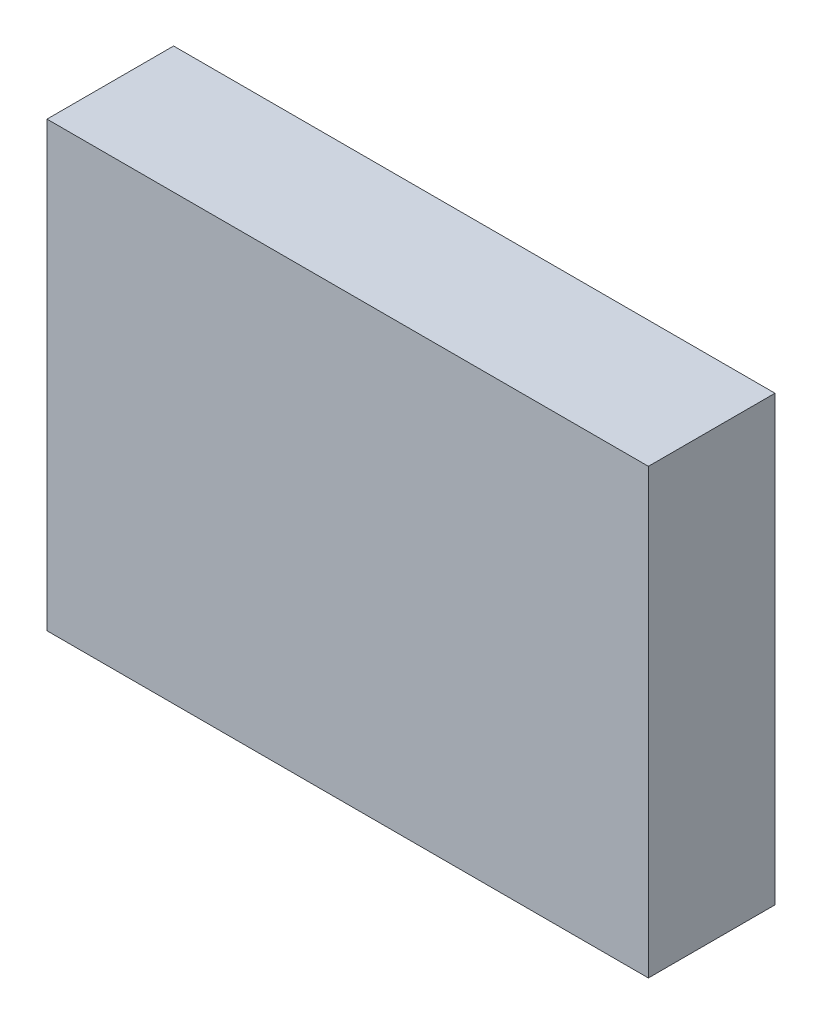
ISO-10303-21;
HEADER;
FILE_DESCRIPTION(('STEP AP214'),'2;1');
FILE_NAME('part.step','',(''),(''),'','','');
FILE_SCHEMA(('AUTOMOTIVE_DESIGN { 1 0 10303 214 1 1 1 1 }'));
ENDSEC;
DATA;
#1=APPLICATION_CONTEXT('core data for automotive mechanical design processes');
#2=APPLICATION_PROTOCOL_DEFINITION('international standard','automotive_design',2000,#1);
#3=PRODUCT_CONTEXT('',#1,'mechanical');
#4=PRODUCT('Part','Part','',(#3));
#5=PRODUCT_RELATED_PRODUCT_CATEGORY('part','',(#4));
#6=PRODUCT_DEFINITION_FORMATION('','',#4);
#7=PRODUCT_DEFINITION_CONTEXT('part definition',#1,'design');
#8=PRODUCT_DEFINITION('design','',#6,#7);
#9=PRODUCT_DEFINITION_SHAPE('','',#8);
#10=(LENGTH_UNIT() NAMED_UNIT(*) SI_UNIT(.MILLI.,.METRE.));
#11=(NAMED_UNIT(*) PLANE_ANGLE_UNIT() SI_UNIT($,.RADIAN.));
#12=(NAMED_UNIT(*) SI_UNIT($,.STERADIAN.) SOLID_ANGLE_UNIT());
#13=UNCERTAINTY_MEASURE_WITH_UNIT(LENGTH_MEASURE(1.E-05),#10,'distance_accuracy_value','');
#14=(GEOMETRIC_REPRESENTATION_CONTEXT(3) GLOBAL_UNCERTAINTY_ASSIGNED_CONTEXT((#13)) GLOBAL_UNIT_ASSIGNED_CONTEXT((#10,
#11,#12)) REPRESENTATION_CONTEXT('',''));
#15=CARTESIAN_POINT('',(0.,0.,0.));
#16=DIRECTION('',(0.,0.,1.));
#17=DIRECTION('',(1.,0.,0.));
#18=AXIS2_PLACEMENT_3D('',#15,#16,#17);
#19=CARTESIAN_POINT('',(38.660044942898,75.9466253968088,25.4));
#20=DIRECTION('',(-1.,0.,0.));
#21=DIRECTION('',(0.,0.,1.));
#22=AXIS2_PLACEMENT_3D('',#19,#20,#21);
#23=PLANE('',#22);
#24=DIRECTION('',(0.,1.,0.));
#25=VECTOR('',#24,1.);
#26=CARTESIAN_POINT('',(38.660044942898,75.9466253968088,0.));
#27=LINE('',#26,#25);
#28=CARTESIAN_POINT('',(38.660044942898,75.9466253968088,0.));
#29=VERTEX_POINT('',#28);
#30=CARTESIAN_POINT('',(38.660044942898,164.846625396809,0.));
#31=VERTEX_POINT('',#30);
#32=EDGE_CURVE('E95',#29,#31,#27,.T.);
#33=ORIENTED_EDGE('',*,*,#32,.T.);
#34=DIRECTION('',(0.,0.,-1.));
#35=VECTOR('',#34,1.);
#36=CARTESIAN_POINT('',(38.660044942898,164.846625396809,25.4));
#37=LINE('',#36,#35);
#38=CARTESIAN_POINT('',(38.660044942898,164.846625396809,25.4));
#39=VERTEX_POINT('',#38);
#40=EDGE_CURVE('E11',#39,#31,#37,.T.);
#41=ORIENTED_EDGE('',*,*,#40,.F.);
#42=DIRECTION('',(0.,1.,0.));
#43=VECTOR('',#42,1.);
#44=CARTESIAN_POINT('',(38.660044942898,75.9466253968088,25.4));
#45=LINE('',#44,#43);
#46=CARTESIAN_POINT('',(38.660044942898,75.9466253968088,25.4));
#47=VERTEX_POINT('',#46);
#48=EDGE_CURVE('E83',#47,#39,#45,.T.);
#49=ORIENTED_EDGE('',*,*,#48,.F.);
#50=DIRECTION('',(0.,0.,-1.));
#51=VECTOR('',#50,1.);
#52=CARTESIAN_POINT('',(38.660044942898,75.9466253968088,25.4));
#53=LINE('',#52,#51);
#54=EDGE_CURVE('E91',#47,#29,#53,.T.);
#55=ORIENTED_EDGE('',*,*,#54,.T.);
#56=EDGE_LOOP('',(#33,#41,#49,#55));
#57=FACE_BOUND('',#56,.T.);
#58=ADVANCED_FACE('F32',(#57),#23,.F.);
#59=CARTESIAN_POINT('',(-81.989955057102,164.846625396809,25.4));
#60=DIRECTION('',(0.,-1.,0.));
#61=DIRECTION('',(0.,0.,-1.));
#62=AXIS2_PLACEMENT_3D('',#59,#60,#61);
#63=PLANE('',#62);
#64=DIRECTION('',(-1.,0.,0.));
#65=VECTOR('',#64,1.);
#66=CARTESIAN_POINT('',(-81.989955057102,164.846625396809,0.));
#67=LINE('',#66,#65);
#68=CARTESIAN_POINT('',(-81.989955057102,164.846625396809,0.));
#69=VERTEX_POINT('',#68);
#70=EDGE_CURVE('E87',#31,#69,#67,.T.);
#71=ORIENTED_EDGE('',*,*,#70,.T.);
#72=DIRECTION('',(0.,0.,-1.));
#73=VECTOR('',#72,1.);
#74=CARTESIAN_POINT('',(-81.989955057102,164.846625396809,25.4));
#75=LINE('',#74,#73);
#76=CARTESIAN_POINT('',(-81.989955057102,164.846625396809,25.4));
#77=VERTEX_POINT('',#76);
#78=EDGE_CURVE('E40',#77,#69,#75,.T.);
#79=ORIENTED_EDGE('',*,*,#78,.F.);
#80=DIRECTION('',(-1.,0.,0.));
#81=VECTOR('',#80,1.);
#82=CARTESIAN_POINT('',(-81.989955057102,164.846625396809,25.4));
#83=LINE('',#82,#81);
#84=EDGE_CURVE('E78',#39,#77,#83,.T.);
#85=ORIENTED_EDGE('',*,*,#84,.F.);
#86=ORIENTED_EDGE('',*,*,#40,.T.);
#87=EDGE_LOOP('',(#71,#79,#85,#86));
#88=FACE_BOUND('',#87,.T.);
#89=ADVANCED_FACE('F86',(#88),#63,.F.);
#90=CARTESIAN_POINT('',(-81.989955057102,75.9466253968088,25.4));
#91=DIRECTION('',(1.,0.,0.));
#92=DIRECTION('',(0.,0.,-1.));
#93=AXIS2_PLACEMENT_3D('',#90,#91,#92);
#94=PLANE('',#93);
#95=DIRECTION('',(0.,-1.,0.));
#96=VECTOR('',#95,1.);
#97=CARTESIAN_POINT('',(-81.989955057102,75.9466253968088,0.));
#98=LINE('',#97,#96);
#99=CARTESIAN_POINT('',(-81.989955057102,75.9466253968088,0.));
#100=VERTEX_POINT('',#99);
#101=EDGE_CURVE('E65',#69,#100,#98,.T.);
#102=ORIENTED_EDGE('',*,*,#101,.T.);
#103=DIRECTION('',(0.,0.,-1.));
#104=VECTOR('',#103,1.);
#105=CARTESIAN_POINT('',(-81.989955057102,75.9466253968088,25.4));
#106=LINE('',#105,#104);
#107=CARTESIAN_POINT('',(-81.989955057102,75.9466253968088,25.4));
#108=VERTEX_POINT('',#107);
#109=EDGE_CURVE('E88',#108,#100,#106,.T.);
#110=ORIENTED_EDGE('',*,*,#109,.F.);
#111=DIRECTION('',(0.,-1.,0.));
#112=VECTOR('',#111,1.);
#113=CARTESIAN_POINT('',(-81.989955057102,75.9466253968088,25.4));
#114=LINE('',#113,#112);
#115=EDGE_CURVE('E81',#77,#108,#114,.T.);
#116=ORIENTED_EDGE('',*,*,#115,.F.);
#117=ORIENTED_EDGE('',*,*,#78,.T.);
#118=EDGE_LOOP('',(#102,#110,#116,#117));
#119=FACE_BOUND('',#118,.T.);
#120=ADVANCED_FACE('F89',(#119),#94,.F.);
#121=CARTESIAN_POINT('',(-81.989955057102,75.9466253968088,25.4));
#122=DIRECTION('',(0.,1.,0.));
#123=DIRECTION('',(0.,0.,1.));
#124=AXIS2_PLACEMENT_3D('',#121,#122,#123);
#125=PLANE('',#124);
#126=DIRECTION('',(1.,0.,0.));
#127=VECTOR('',#126,1.);
#128=CARTESIAN_POINT('',(-81.989955057102,75.9466253968088,0.));
#129=LINE('',#128,#127);
#130=EDGE_CURVE('E71',#100,#29,#129,.T.);
#131=ORIENTED_EDGE('',*,*,#130,.T.);
#132=ORIENTED_EDGE('',*,*,#54,.F.);
#133=DIRECTION('',(1.,0.,0.));
#134=VECTOR('',#133,1.);
#135=CARTESIAN_POINT('',(-81.989955057102,75.9466253968088,25.4));
#136=LINE('',#135,#134);
#137=EDGE_CURVE('E48',#108,#47,#136,.T.);
#138=ORIENTED_EDGE('',*,*,#137,.F.);
#139=ORIENTED_EDGE('',*,*,#109,.T.);
#140=EDGE_LOOP('',(#131,#132,#138,#139));
#141=FACE_BOUND('',#140,.T.);
#142=ADVANCED_FACE('F102',(#141),#125,.F.);
#143=CARTESIAN_POINT('',(0.,0.,25.4));
#144=DIRECTION('',(0.,0.,-1.));
#145=DIRECTION('',(-1.,0.,0.));
#146=AXIS2_PLACEMENT_3D('',#143,#144,#145);
#147=PLANE('',#146);
#148=ORIENTED_EDGE('',*,*,#48,.T.);
#149=ORIENTED_EDGE('',*,*,#84,.T.);
#150=ORIENTED_EDGE('',*,*,#115,.T.);
#151=ORIENTED_EDGE('',*,*,#137,.T.);
#152=EDGE_LOOP('',(#148,#149,#150,#151));
#153=FACE_BOUND('',#152,.T.);
#154=ADVANCED_FACE('F79',(#153),#147,.F.);
#155=CARTESIAN_POINT('',(0.,0.,0.));
#156=DIRECTION('',(0.,0.,-1.));
#157=DIRECTION('',(-1.,0.,0.));
#158=AXIS2_PLACEMENT_3D('',#155,#156,#157);
#159=PLANE('',#158);
#160=ORIENTED_EDGE('',*,*,#32,.F.);
#161=ORIENTED_EDGE('',*,*,#130,.F.);
#162=ORIENTED_EDGE('',*,*,#101,.F.);
#163=ORIENTED_EDGE('',*,*,#70,.F.);
#164=EDGE_LOOP('',(#160,#161,#162,#163));
#165=FACE_BOUND('',#164,.T.);
#166=ADVANCED_FACE('F105',(#165),#159,.T.);
#167=CLOSED_SHELL('',(#58,#89,#120,#142,#154,#166));
#168=MANIFOLD_SOLID_BREP('B2',#167);
#169=ADVANCED_BREP_SHAPE_REPRESENTATION('',(#18,#168),#14);
#170=SHAPE_DEFINITION_REPRESENTATION(#9,#169);
ENDSEC;
END-ISO-10303-21;
